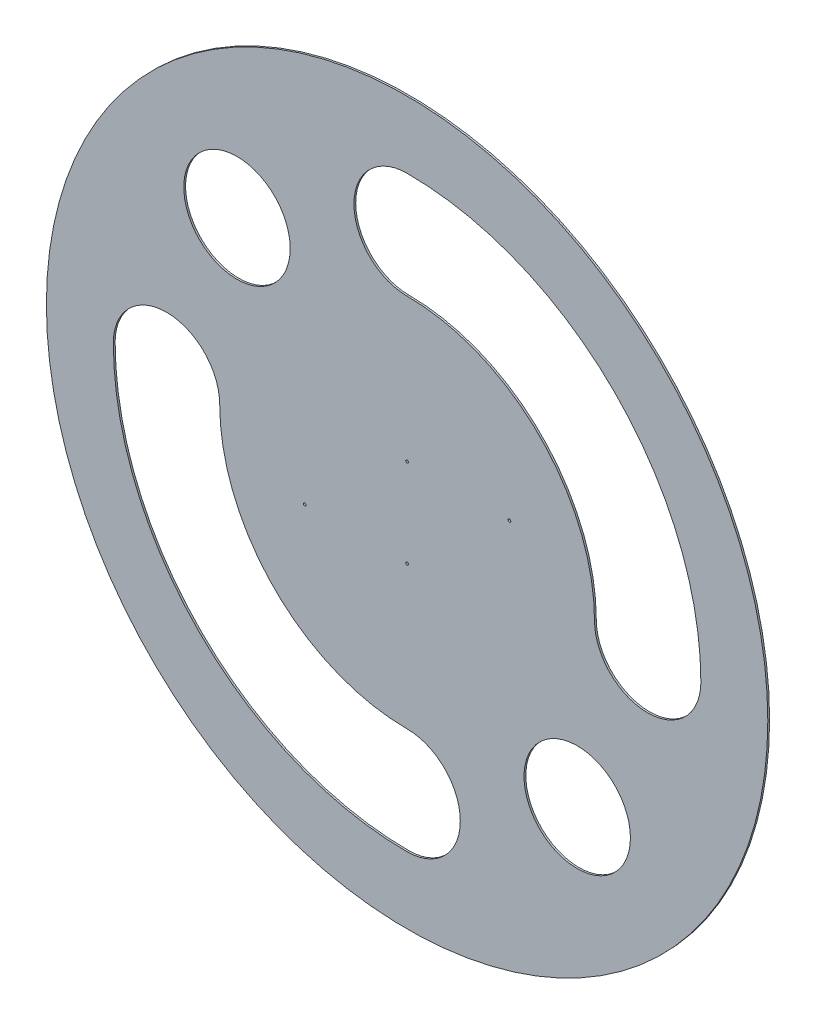
ISO-10303-21;
HEADER;
FILE_DESCRIPTION(('STEP AP214'),'2;1');
FILE_NAME('part.step','',(''),(''),'','','');
FILE_SCHEMA(('AUTOMOTIVE_DESIGN { 1 0 10303 214 1 1 1 1 }'));
ENDSEC;
DATA;
#1=APPLICATION_CONTEXT('core data for automotive mechanical design processes');
#2=APPLICATION_PROTOCOL_DEFINITION('international standard','automotive_design',2000,#1);
#3=PRODUCT_CONTEXT('',#1,'mechanical');
#4=PRODUCT('Part','Part','',(#3));
#5=PRODUCT_RELATED_PRODUCT_CATEGORY('part','',(#4));
#6=PRODUCT_DEFINITION_FORMATION('','',#4);
#7=PRODUCT_DEFINITION_CONTEXT('part definition',#1,'design');
#8=PRODUCT_DEFINITION('design','',#6,#7);
#9=PRODUCT_DEFINITION_SHAPE('','',#8);
#10=(LENGTH_UNIT() NAMED_UNIT(*) SI_UNIT(.MILLI.,.METRE.));
#11=(NAMED_UNIT(*) PLANE_ANGLE_UNIT() SI_UNIT($,.RADIAN.));
#12=(NAMED_UNIT(*) SI_UNIT($,.STERADIAN.) SOLID_ANGLE_UNIT());
#13=UNCERTAINTY_MEASURE_WITH_UNIT(LENGTH_MEASURE(1.E-05),#10,'distance_accuracy_value','');
#14=(GEOMETRIC_REPRESENTATION_CONTEXT(3) GLOBAL_UNCERTAINTY_ASSIGNED_CONTEXT((#13)) GLOBAL_UNIT_ASSIGNED_CONTEXT((#10,
#11,#12)) REPRESENTATION_CONTEXT('',''));
#15=CARTESIAN_POINT('',(0.,0.,0.));
#16=DIRECTION('',(0.,0.,1.));
#17=DIRECTION('',(1.,0.,0.));
#18=AXIS2_PLACEMENT_3D('',#15,#16,#17);
#19=CARTESIAN_POINT('',(0.,0.,2.));
#20=DIRECTION('',(0.,0.,-1.));
#21=DIRECTION('',(-1.,0.,0.));
#22=AXIS2_PLACEMENT_3D('',#19,#20,#21);
#23=CYLINDRICAL_SURFACE('',#22,325.76367295281);
#24=CARTESIAN_POINT('',(0.,0.,0.));
#25=DIRECTION('',(0.,0.,1.));
#26=DIRECTION('',(1.,0.,0.));
#27=AXIS2_PLACEMENT_3D('',#24,#25,#26);
#28=CIRCLE('',#27,325.76367295281);
#29=CARTESIAN_POINT('',(-3.4196483767755E-12,325.76367295281,0.));
#30=VERTEX_POINT('',#29);
#31=CARTESIAN_POINT('',(325.76367295281,0.,0.));
#32=VERTEX_POINT('',#31);
#33=EDGE_CURVE('E164',#30,#32,#28,.F.);
#34=ORIENTED_EDGE('',*,*,#33,.T.);
#35=DIRECTION('',(0.,0.,-1.));
#36=VECTOR('',#35,1.);
#37=CARTESIAN_POINT('',(325.76367295281,0.,2.));
#38=LINE('',#37,#36);
#39=CARTESIAN_POINT('',(325.76367295281,0.,2.));
#40=VERTEX_POINT('',#39);
#41=EDGE_CURVE('E11',#40,#32,#38,.T.);
#42=ORIENTED_EDGE('',*,*,#41,.F.);
#43=CARTESIAN_POINT('',(0.,0.,2.));
#44=DIRECTION('',(0.,0.,1.));
#45=DIRECTION('',(1.,0.,0.));
#46=AXIS2_PLACEMENT_3D('',#43,#44,#45);
#47=CIRCLE('',#46,325.76367295281);
#48=CARTESIAN_POINT('',(-3.4196483767755E-12,325.76367295281,2.));
#49=VERTEX_POINT('',#48);
#50=EDGE_CURVE('E114',#49,#40,#47,.F.);
#51=ORIENTED_EDGE('',*,*,#50,.F.);
#52=DIRECTION('',(0.,0.,-1.));
#53=VECTOR('',#52,1.);
#54=CARTESIAN_POINT('',(-3.4196483767755E-12,325.76367295281,2.));
#55=LINE('',#54,#53);
#56=EDGE_CURVE('E172',#49,#30,#55,.T.);
#57=ORIENTED_EDGE('',*,*,#56,.T.);
#58=EDGE_LOOP('',(#34,#42,#51,#57));
#59=FACE_BOUND('',#58,.T.);
#60=ADVANCED_FACE('F37',(#59),#23,.F.);
#61=CARTESIAN_POINT('',(266.784994262618,2.83106871279415E-12,2.));
#62=DIRECTION('',(0.,0.,-1.));
#63=DIRECTION('',(-1.,0.,0.));
#64=AXIS2_PLACEMENT_3D('',#61,#62,#63);
#65=CYLINDRICAL_SURFACE('',#64,58.978678690192);
#66=CARTESIAN_POINT('',(266.784994262618,2.83106871279415E-12,0.));
#67=DIRECTION('',(0.,0.,1.));
#68=DIRECTION('',(1.,0.,0.));
#69=AXIS2_PLACEMENT_3D('',#66,#67,#68);
#70=CIRCLE('',#69,58.978678690192);
#71=CARTESIAN_POINT('',(207.806315572426,0.,0.));
#72=VERTEX_POINT('',#71);
#73=EDGE_CURVE('E120',#32,#72,#70,.F.);
#74=ORIENTED_EDGE('',*,*,#73,.T.);
#75=DIRECTION('',(0.,0.,-1.));
#76=VECTOR('',#75,1.);
#77=CARTESIAN_POINT('',(207.806315572426,0.,2.));
#78=LINE('',#77,#76);
#79=CARTESIAN_POINT('',(207.806315572426,0.,2.));
#80=VERTEX_POINT('',#79);
#81=EDGE_CURVE('E47',#80,#72,#78,.T.);
#82=ORIENTED_EDGE('',*,*,#81,.F.);
#83=CARTESIAN_POINT('',(266.784994262618,2.83106871279415E-12,2.));
#84=DIRECTION('',(0.,0.,1.));
#85=DIRECTION('',(1.,0.,0.));
#86=AXIS2_PLACEMENT_3D('',#83,#84,#85);
#87=CIRCLE('',#86,58.978678690192);
#88=EDGE_CURVE('E108',#40,#80,#87,.F.);
#89=ORIENTED_EDGE('',*,*,#88,.F.);
#90=ORIENTED_EDGE('',*,*,#41,.T.);
#91=EDGE_LOOP('',(#74,#82,#89,#90));
#92=FACE_BOUND('',#91,.T.);
#93=ADVANCED_FACE('F119',(#92),#65,.F.);
#94=CARTESIAN_POINT('',(0.,0.,2.));
#95=DIRECTION('',(0.,0.,-1.));
#96=DIRECTION('',(-1.,0.,0.));
#97=AXIS2_PLACEMENT_3D('',#94,#95,#96);
#98=CYLINDRICAL_SURFACE('',#97,207.806315572426);
#99=CARTESIAN_POINT('',(0.,0.,0.));
#100=DIRECTION('',(0.,0.,1.));
#101=DIRECTION('',(1.,0.,0.));
#102=AXIS2_PLACEMENT_3D('',#99,#100,#101);
#103=CIRCLE('',#102,207.806315572426);
#104=CARTESIAN_POINT('',(-2.18141121534409E-12,207.806315572426,0.));
#105=VERTEX_POINT('',#104);
#106=EDGE_CURVE('E168',#105,#72,#103,.F.);
#107=ORIENTED_EDGE('',*,*,#106,.F.);
#108=DIRECTION('',(0.,0.,-1.));
#109=VECTOR('',#108,1.);
#110=CARTESIAN_POINT('',(-2.18141121534409E-12,207.806315572426,2.));
#111=LINE('',#110,#109);
#112=CARTESIAN_POINT('',(-2.18141121534409E-12,207.806315572426,2.));
#113=VERTEX_POINT('',#112);
#114=EDGE_CURVE('E84',#113,#105,#111,.T.);
#115=ORIENTED_EDGE('',*,*,#114,.F.);
#116=CARTESIAN_POINT('',(0.,0.,2.));
#117=DIRECTION('',(0.,0.,1.));
#118=DIRECTION('',(1.,0.,0.));
#119=AXIS2_PLACEMENT_3D('',#116,#117,#118);
#120=CIRCLE('',#119,207.806315572426);
#121=EDGE_CURVE('E112',#113,#80,#120,.F.);
#122=ORIENTED_EDGE('',*,*,#121,.T.);
#123=ORIENTED_EDGE('',*,*,#81,.T.);
#124=EDGE_LOOP('',(#107,#115,#122,#123));
#125=FACE_BOUND('',#124,.T.);
#126=ADVANCED_FACE('F125',(#125),#98,.T.);
#127=CARTESIAN_POINT('',(0.,-266.784994262618,2.));
#128=DIRECTION('',(0.,0.,-1.));
#129=DIRECTION('',(-1.,0.,0.));
#130=AXIS2_PLACEMENT_3D('',#127,#128,#129);
#131=CYLINDRICAL_SURFACE('',#130,58.978678690192);
#132=CARTESIAN_POINT('',(0.,-266.784994262618,0.));
#133=DIRECTION('',(0.,0.,1.));
#134=DIRECTION('',(1.,0.,0.));
#135=AXIS2_PLACEMENT_3D('',#132,#133,#134);
#136=CIRCLE('',#135,58.978678690192);
#137=CARTESIAN_POINT('',(0.,-325.76367295281,0.));
#138=VERTEX_POINT('',#137);
#139=CARTESIAN_POINT('',(0.,-207.806315572426,0.));
#140=VERTEX_POINT('',#139);
#141=EDGE_CURVE('E137',#138,#140,#136,.T.);
#142=ORIENTED_EDGE('',*,*,#141,.F.);
#143=DIRECTION('',(0.,0.,-1.));
#144=VECTOR('',#143,1.);
#145=CARTESIAN_POINT('',(0.,-325.76367295281,2.));
#146=LINE('',#145,#144);
#147=CARTESIAN_POINT('',(0.,-325.76367295281,2.));
#148=VERTEX_POINT('',#147);
#149=EDGE_CURVE('E41',#148,#138,#146,.T.);
#150=ORIENTED_EDGE('',*,*,#149,.F.);
#151=CARTESIAN_POINT('',(0.,-266.784994262618,2.));
#152=DIRECTION('',(0.,0.,1.));
#153=DIRECTION('',(1.,0.,0.));
#154=AXIS2_PLACEMENT_3D('',#151,#152,#153);
#155=CIRCLE('',#154,58.978678690192);
#156=CARTESIAN_POINT('',(0.,-207.806315572426,2.));
#157=VERTEX_POINT('',#156);
#158=EDGE_CURVE('E205',#148,#157,#155,.T.);
#159=ORIENTED_EDGE('',*,*,#158,.T.);
#160=DIRECTION('',(0.,0.,-1.));
#161=VECTOR('',#160,1.);
#162=CARTESIAN_POINT('',(0.,-207.806315572426,2.));
#163=LINE('',#162,#161);
#164=EDGE_CURVE('E127',#157,#140,#163,.T.);
#165=ORIENTED_EDGE('',*,*,#164,.T.);
#166=EDGE_LOOP('',(#142,#150,#159,#165));
#167=FACE_BOUND('',#166,.T.);
#168=ADVANCED_FACE('F187',(#167),#131,.F.);
#169=CARTESIAN_POINT('',(0.,0.,2.));
#170=DIRECTION('',(0.,0.,-1.));
#171=DIRECTION('',(-1.,0.,0.));
#172=AXIS2_PLACEMENT_3D('',#169,#170,#171);
#173=CYLINDRICAL_SURFACE('',#172,325.76367295281);
#174=CARTESIAN_POINT('',(0.,0.,0.));
#175=DIRECTION('',(0.,0.,1.));
#176=DIRECTION('',(1.,0.,0.));
#177=AXIS2_PLACEMENT_3D('',#174,#175,#176);
#178=CIRCLE('',#177,325.76367295281);
#179=CARTESIAN_POINT('',(-325.76367295281,0.,0.));
#180=VERTEX_POINT('',#179);
#181=EDGE_CURVE('E140',#180,#138,#178,.T.);
#182=ORIENTED_EDGE('',*,*,#181,.F.);
#183=DIRECTION('',(0.,0.,-1.));
#184=VECTOR('',#183,1.);
#185=CARTESIAN_POINT('',(-325.76367295281,0.,2.));
#186=LINE('',#185,#184);
#187=CARTESIAN_POINT('',(-325.76367295281,0.,2.));
#188=VERTEX_POINT('',#187);
#189=EDGE_CURVE('E177',#188,#180,#186,.T.);
#190=ORIENTED_EDGE('',*,*,#189,.F.);
#191=CARTESIAN_POINT('',(0.,0.,2.));
#192=DIRECTION('',(0.,0.,1.));
#193=DIRECTION('',(1.,0.,0.));
#194=AXIS2_PLACEMENT_3D('',#191,#192,#193);
#195=CIRCLE('',#194,325.76367295281);
#196=EDGE_CURVE('E186',#188,#148,#195,.T.);
#197=ORIENTED_EDGE('',*,*,#196,.T.);
#198=ORIENTED_EDGE('',*,*,#149,.T.);
#199=EDGE_LOOP('',(#182,#190,#197,#198));
#200=FACE_BOUND('',#199,.T.);
#201=ADVANCED_FACE('F184',(#200),#173,.F.);
#202=CARTESIAN_POINT('',(-266.784994262618,0.,2.));
#203=DIRECTION('',(0.,0.,-1.));
#204=DIRECTION('',(-1.,0.,0.));
#205=AXIS2_PLACEMENT_3D('',#202,#203,#204);
#206=CYLINDRICAL_SURFACE('',#205,58.978678690192);
#207=CARTESIAN_POINT('',(-266.784994262618,0.,0.));
#208=DIRECTION('',(0.,0.,1.));
#209=DIRECTION('',(1.,0.,0.));
#210=AXIS2_PLACEMENT_3D('',#207,#208,#209);
#211=CIRCLE('',#210,58.978678690192);
#212=CARTESIAN_POINT('',(-207.806315572426,0.,0.));
#213=VERTEX_POINT('',#212);
#214=EDGE_CURVE('E143',#213,#180,#211,.T.);
#215=ORIENTED_EDGE('',*,*,#214,.F.);
#216=DIRECTION('',(0.,0.,-1.));
#217=VECTOR('',#216,1.);
#218=CARTESIAN_POINT('',(-207.806315572426,0.,2.));
#219=LINE('',#218,#217);
#220=CARTESIAN_POINT('',(-207.806315572426,0.,2.));
#221=VERTEX_POINT('',#220);
#222=EDGE_CURVE('E176',#221,#213,#219,.T.);
#223=ORIENTED_EDGE('',*,*,#222,.F.);
#224=CARTESIAN_POINT('',(-266.784994262618,0.,2.));
#225=DIRECTION('',(0.,0.,1.));
#226=DIRECTION('',(1.,0.,0.));
#227=AXIS2_PLACEMENT_3D('',#224,#225,#226);
#228=CIRCLE('',#227,58.978678690192);
#229=EDGE_CURVE('E196',#221,#188,#228,.T.);
#230=ORIENTED_EDGE('',*,*,#229,.T.);
#231=ORIENTED_EDGE('',*,*,#189,.T.);
#232=EDGE_LOOP('',(#215,#223,#230,#231));
#233=FACE_BOUND('',#232,.T.);
#234=ADVANCED_FACE('F193',(#233),#206,.F.);
#235=CARTESIAN_POINT('',(0.,0.,2.));
#236=DIRECTION('',(0.,0.,-1.));
#237=DIRECTION('',(-1.,0.,0.));
#238=AXIS2_PLACEMENT_3D('',#235,#236,#237);
#239=CYLINDRICAL_SURFACE('',#238,400.);
#240=CARTESIAN_POINT('',(0.,0.,2.));
#241=DIRECTION('',(0.,0.,1.));
#242=DIRECTION('',(1.,0.,0.));
#243=AXIS2_PLACEMENT_3D('',#240,#241,#242);
#244=CIRCLE('',#243,400.);
#245=CARTESIAN_POINT('',(400.,0.,2.));
#246=VERTEX_POINT('',#245);
#247=EDGE_CURVE('E220',#246,#246,#244,.T.);
#248=ORIENTED_EDGE('',*,*,#247,.F.);
#249=EDGE_LOOP('',(#248));
#250=FACE_BOUND('',#249,.T.);
#251=CARTESIAN_POINT('',(0.,0.,0.));
#252=DIRECTION('',(0.,0.,1.));
#253=DIRECTION('',(1.,0.,0.));
#254=AXIS2_PLACEMENT_3D('',#251,#252,#253);
#255=CIRCLE('',#254,400.);
#256=CARTESIAN_POINT('',(400.,0.,0.));
#257=VERTEX_POINT('',#256);
#258=EDGE_CURVE('E161',#257,#257,#255,.T.);
#259=ORIENTED_EDGE('',*,*,#258,.T.);
#260=EDGE_LOOP('',(#259));
#261=FACE_BOUND('',#260,.T.);
#262=ADVANCED_FACE('F225',(#250,#261),#239,.T.);
#263=CARTESIAN_POINT('',(0.,-49.,2.));
#264=DIRECTION('',(0.,0.,-1.));
#265=DIRECTION('',(-1.,0.,0.));
#266=AXIS2_PLACEMENT_3D('',#263,#264,#265);
#267=CYLINDRICAL_SURFACE('',#266,1.5);
#268=CARTESIAN_POINT('',(0.,-49.,2.));
#269=DIRECTION('',(0.,0.,1.));
#270=DIRECTION('',(1.,0.,0.));
#271=AXIS2_PLACEMENT_3D('',#268,#269,#270);
#272=CIRCLE('',#271,1.5);
#273=CARTESIAN_POINT('',(1.5,-49.,2.));
#274=VERTEX_POINT('',#273);
#275=EDGE_CURVE('E217',#274,#274,#272,.T.);
#276=ORIENTED_EDGE('',*,*,#275,.T.);
#277=EDGE_LOOP('',(#276));
#278=FACE_BOUND('',#277,.T.);
#279=CARTESIAN_POINT('',(0.,-49.,0.));
#280=DIRECTION('',(0.,0.,1.));
#281=DIRECTION('',(1.,0.,0.));
#282=AXIS2_PLACEMENT_3D('',#279,#280,#281);
#283=CIRCLE('',#282,1.5);
#284=CARTESIAN_POINT('',(1.5,-49.,0.));
#285=VERTEX_POINT('',#284);
#286=EDGE_CURVE('E158',#285,#285,#283,.T.);
#287=ORIENTED_EDGE('',*,*,#286,.F.);
#288=EDGE_LOOP('',(#287));
#289=FACE_BOUND('',#288,.T.);
#290=ADVANCED_FACE('F228',(#278,#289),#267,.F.);
#291=CARTESIAN_POINT('',(0.,49.,2.));
#292=DIRECTION('',(0.,0.,-1.));
#293=DIRECTION('',(-1.,0.,0.));
#294=AXIS2_PLACEMENT_3D('',#291,#292,#293);
#295=CYLINDRICAL_SURFACE('',#294,1.5);
#296=CARTESIAN_POINT('',(0.,49.,2.));
#297=DIRECTION('',(0.,0.,1.));
#298=DIRECTION('',(1.,0.,0.));
#299=AXIS2_PLACEMENT_3D('',#296,#297,#298);
#300=CIRCLE('',#299,1.5);
#301=CARTESIAN_POINT('',(1.5,49.,2.));
#302=VERTEX_POINT('',#301);
#303=EDGE_CURVE('E214',#302,#302,#300,.T.);
#304=ORIENTED_EDGE('',*,*,#303,.T.);
#305=EDGE_LOOP('',(#304));
#306=FACE_BOUND('',#305,.T.);
#307=CARTESIAN_POINT('',(0.,49.,0.));
#308=DIRECTION('',(0.,0.,1.));
#309=DIRECTION('',(1.,0.,0.));
#310=AXIS2_PLACEMENT_3D('',#307,#308,#309);
#311=CIRCLE('',#310,1.5);
#312=CARTESIAN_POINT('',(1.5,49.,0.));
#313=VERTEX_POINT('',#312);
#314=EDGE_CURVE('E155',#313,#313,#311,.T.);
#315=ORIENTED_EDGE('',*,*,#314,.F.);
#316=EDGE_LOOP('',(#315));
#317=FACE_BOUND('',#316,.T.);
#318=ADVANCED_FACE('F259',(#306,#317),#295,.F.);
#319=CARTESIAN_POINT('',(-113.5,-49.,2.));
#320=DIRECTION('',(0.,0.,-1.));
#321=DIRECTION('',(-1.,0.,0.));
#322=AXIS2_PLACEMENT_3D('',#319,#320,#321);
#323=CYLINDRICAL_SURFACE('',#322,1.5);
#324=CARTESIAN_POINT('',(-113.5,-49.,2.));
#325=DIRECTION('',(0.,0.,1.));
#326=DIRECTION('',(1.,0.,0.));
#327=AXIS2_PLACEMENT_3D('',#324,#325,#326);
#328=CIRCLE('',#327,1.5);
#329=CARTESIAN_POINT('',(-112.,-49.,2.));
#330=VERTEX_POINT('',#329);
#331=EDGE_CURVE('E211',#330,#330,#328,.T.);
#332=ORIENTED_EDGE('',*,*,#331,.T.);
#333=EDGE_LOOP('',(#332));
#334=FACE_BOUND('',#333,.T.);
#335=CARTESIAN_POINT('',(-113.5,-49.,0.));
#336=DIRECTION('',(0.,0.,1.));
#337=DIRECTION('',(1.,0.,0.));
#338=AXIS2_PLACEMENT_3D('',#335,#336,#337);
#339=CIRCLE('',#338,1.5);
#340=CARTESIAN_POINT('',(-112.,-49.,0.));
#341=VERTEX_POINT('',#340);
#342=EDGE_CURVE('E152',#341,#341,#339,.T.);
#343=ORIENTED_EDGE('',*,*,#342,.F.);
#344=EDGE_LOOP('',(#343));
#345=FACE_BOUND('',#344,.T.);
#346=ADVANCED_FACE('F263',(#334,#345),#323,.F.);
#347=CARTESIAN_POINT('',(113.5,49.,2.));
#348=DIRECTION('',(0.,0.,-1.));
#349=DIRECTION('',(-1.,0.,0.));
#350=AXIS2_PLACEMENT_3D('',#347,#348,#349);
#351=CYLINDRICAL_SURFACE('',#350,1.5);
#352=CARTESIAN_POINT('',(113.5,49.,2.));
#353=DIRECTION('',(0.,0.,1.));
#354=DIRECTION('',(1.,0.,0.));
#355=AXIS2_PLACEMENT_3D('',#352,#353,#354);
#356=CIRCLE('',#355,1.5);
#357=CARTESIAN_POINT('',(115.,49.,2.));
#358=VERTEX_POINT('',#357);
#359=EDGE_CURVE('E201',#358,#358,#356,.T.);
#360=ORIENTED_EDGE('',*,*,#359,.T.);
#361=EDGE_LOOP('',(#360));
#362=FACE_BOUND('',#361,.T.);
#363=CARTESIAN_POINT('',(113.5,49.,0.));
#364=DIRECTION('',(0.,0.,1.));
#365=DIRECTION('',(1.,0.,0.));
#366=AXIS2_PLACEMENT_3D('',#363,#364,#365);
#367=CIRCLE('',#366,1.5);
#368=CARTESIAN_POINT('',(115.,49.,0.));
#369=VERTEX_POINT('',#368);
#370=EDGE_CURVE('E149',#369,#369,#367,.T.);
#371=ORIENTED_EDGE('',*,*,#370,.F.);
#372=EDGE_LOOP('',(#371));
#373=FACE_BOUND('',#372,.T.);
#374=ADVANCED_FACE('F267',(#362,#373),#351,.F.);
#375=CARTESIAN_POINT('',(0.,0.,2.));
#376=DIRECTION('',(0.,0.,-1.));
#377=DIRECTION('',(-1.,0.,0.));
#378=AXIS2_PLACEMENT_3D('',#375,#376,#377);
#379=CYLINDRICAL_SURFACE('',#378,207.806315572426);
#380=CARTESIAN_POINT('',(0.,0.,0.));
#381=DIRECTION('',(0.,0.,1.));
#382=DIRECTION('',(1.,0.,0.));
#383=AXIS2_PLACEMENT_3D('',#380,#381,#382);
#384=CIRCLE('',#383,207.806315572426);
#385=EDGE_CURVE('E146',#213,#140,#384,.T.);
#386=ORIENTED_EDGE('',*,*,#385,.T.);
#387=ORIENTED_EDGE('',*,*,#164,.F.);
#388=CARTESIAN_POINT('',(0.,0.,2.));
#389=DIRECTION('',(0.,0.,1.));
#390=DIRECTION('',(1.,0.,0.));
#391=AXIS2_PLACEMENT_3D('',#388,#389,#390);
#392=CIRCLE('',#391,207.806315572426);
#393=EDGE_CURVE('E198',#221,#157,#392,.T.);
#394=ORIENTED_EDGE('',*,*,#393,.F.);
#395=ORIENTED_EDGE('',*,*,#222,.T.);
#396=EDGE_LOOP('',(#386,#387,#394,#395));
#397=FACE_BOUND('',#396,.T.);
#398=ADVANCED_FACE('F199',(#397),#379,.T.);
#399=CARTESIAN_POINT('',(-188.645478561912,188.64547856191,2.));
#400=DIRECTION('',(0.,0.,-1.));
#401=DIRECTION('',(-1.,0.,0.));
#402=AXIS2_PLACEMENT_3D('',#399,#400,#401);
#403=CYLINDRICAL_SURFACE('',#402,59.);
#404=CARTESIAN_POINT('',(-188.645478561912,188.64547856191,2.));
#405=DIRECTION('',(0.,0.,1.));
#406=DIRECTION('',(1.,0.,0.));
#407=AXIS2_PLACEMENT_3D('',#404,#405,#406);
#408=CIRCLE('',#407,59.);
#409=CARTESIAN_POINT('',(-129.645478561912,188.64547856191,2.));
#410=VERTEX_POINT('',#409);
#411=EDGE_CURVE('E286',#410,#410,#408,.T.);
#412=ORIENTED_EDGE('',*,*,#411,.T.);
#413=EDGE_LOOP('',(#412));
#414=FACE_BOUND('',#413,.T.);
#415=CARTESIAN_POINT('',(-188.645478561912,188.64547856191,0.));
#416=DIRECTION('',(0.,0.,1.));
#417=DIRECTION('',(1.,0.,0.));
#418=AXIS2_PLACEMENT_3D('',#415,#416,#417);
#419=CIRCLE('',#418,59.);
#420=CARTESIAN_POINT('',(-129.645478561912,188.64547856191,0.));
#421=VERTEX_POINT('',#420);
#422=EDGE_CURVE('E134',#421,#421,#419,.T.);
#423=ORIENTED_EDGE('',*,*,#422,.F.);
#424=EDGE_LOOP('',(#423));
#425=FACE_BOUND('',#424,.T.);
#426=ADVANCED_FACE('F247',(#414,#425),#403,.F.);
#427=CARTESIAN_POINT('',(188.645478561913,-188.645478561911,2.));
#428=DIRECTION('',(0.,0.,-1.));
#429=DIRECTION('',(-1.,0.,0.));
#430=AXIS2_PLACEMENT_3D('',#427,#428,#429);
#431=CYLINDRICAL_SURFACE('',#430,59.);
#432=CARTESIAN_POINT('',(188.645478561913,-188.645478561911,2.));
#433=DIRECTION('',(0.,0.,1.));
#434=DIRECTION('',(1.,0.,0.));
#435=AXIS2_PLACEMENT_3D('',#432,#433,#434);
#436=CIRCLE('',#435,59.);
#437=CARTESIAN_POINT('',(247.645478561913,-188.645478561911,2.));
#438=VERTEX_POINT('',#437);
#439=EDGE_CURVE('E171',#438,#438,#436,.T.);
#440=ORIENTED_EDGE('',*,*,#439,.T.);
#441=EDGE_LOOP('',(#440));
#442=FACE_BOUND('',#441,.T.);
#443=CARTESIAN_POINT('',(188.645478561913,-188.645478561911,0.));
#444=DIRECTION('',(0.,0.,1.));
#445=DIRECTION('',(1.,0.,0.));
#446=AXIS2_PLACEMENT_3D('',#443,#444,#445);
#447=CIRCLE('',#446,59.);
#448=CARTESIAN_POINT('',(247.645478561913,-188.645478561911,0.));
#449=VERTEX_POINT('',#448);
#450=EDGE_CURVE('E131',#449,#449,#447,.T.);
#451=ORIENTED_EDGE('',*,*,#450,.F.);
#452=EDGE_LOOP('',(#451));
#453=FACE_BOUND('',#452,.T.);
#454=ADVANCED_FACE('F39',(#442,#453),#431,.F.);
#455=CARTESIAN_POINT('',(-2.77555756156289E-12,266.784994262618,2.));
#456=DIRECTION('',(0.,0.,-1.));
#457=DIRECTION('',(-1.,0.,0.));
#458=AXIS2_PLACEMENT_3D('',#455,#456,#457);
#459=CYLINDRICAL_SURFACE('',#458,58.978678690192);
#460=CARTESIAN_POINT('',(-2.77555756156289E-12,266.784994262618,0.));
#461=DIRECTION('',(0.,0.,1.));
#462=DIRECTION('',(1.,0.,0.));
#463=AXIS2_PLACEMENT_3D('',#460,#461,#462);
#464=CIRCLE('',#463,58.978678690192);
#465=EDGE_CURVE('E87',#105,#30,#464,.F.);
#466=ORIENTED_EDGE('',*,*,#465,.T.);
#467=ORIENTED_EDGE('',*,*,#56,.F.);
#468=CARTESIAN_POINT('',(-2.77555756156289E-12,266.784994262618,2.));
#469=DIRECTION('',(0.,0.,1.));
#470=DIRECTION('',(1.,0.,0.));
#471=AXIS2_PLACEMENT_3D('',#468,#469,#470);
#472=CIRCLE('',#471,58.978678690192);
#473=EDGE_CURVE('E56',#113,#49,#472,.F.);
#474=ORIENTED_EDGE('',*,*,#473,.F.);
#475=ORIENTED_EDGE('',*,*,#114,.T.);
#476=EDGE_LOOP('',(#466,#467,#474,#475));
#477=FACE_BOUND('',#476,.T.);
#478=ADVANCED_FACE('F238',(#477),#459,.F.);
#479=CARTESIAN_POINT('',(0.,0.,2.));
#480=DIRECTION('',(0.,0.,1.));
#481=DIRECTION('',(1.,0.,0.));
#482=AXIS2_PLACEMENT_3D('',#479,#480,#481);
#483=PLANE('',#482);
#484=ORIENTED_EDGE('',*,*,#439,.F.);
#485=EDGE_LOOP('',(#484));
#486=FACE_BOUND('',#485,.T.);
#487=ORIENTED_EDGE('',*,*,#411,.F.);
#488=EDGE_LOOP('',(#487));
#489=FACE_BOUND('',#488,.T.);
#490=ORIENTED_EDGE('',*,*,#158,.F.);
#491=ORIENTED_EDGE('',*,*,#196,.F.);
#492=ORIENTED_EDGE('',*,*,#229,.F.);
#493=ORIENTED_EDGE('',*,*,#393,.T.);
#494=EDGE_LOOP('',(#490,#491,#492,#493));
#495=FACE_BOUND('',#494,.T.);
#496=ORIENTED_EDGE('',*,*,#359,.F.);
#497=EDGE_LOOP('',(#496));
#498=FACE_BOUND('',#497,.T.);
#499=ORIENTED_EDGE('',*,*,#331,.F.);
#500=EDGE_LOOP('',(#499));
#501=FACE_BOUND('',#500,.T.);
#502=ORIENTED_EDGE('',*,*,#303,.F.);
#503=EDGE_LOOP('',(#502));
#504=FACE_BOUND('',#503,.T.);
#505=ORIENTED_EDGE('',*,*,#275,.F.);
#506=EDGE_LOOP('',(#505));
#507=FACE_BOUND('',#506,.T.);
#508=ORIENTED_EDGE('',*,*,#247,.T.);
#509=EDGE_LOOP('',(#508));
#510=FACE_BOUND('',#509,.T.);
#511=ORIENTED_EDGE('',*,*,#50,.T.);
#512=ORIENTED_EDGE('',*,*,#88,.T.);
#513=ORIENTED_EDGE('',*,*,#121,.F.);
#514=ORIENTED_EDGE('',*,*,#473,.T.);
#515=EDGE_LOOP('',(#511,#512,#513,#514));
#516=FACE_BOUND('',#515,.T.);
#517=ADVANCED_FACE('F110',(#486,#489,#495,#498,#501,#504,#507,#510,#516),#483,.T.);
#518=CARTESIAN_POINT('',(0.,0.,0.));
#519=DIRECTION('',(0.,0.,1.));
#520=DIRECTION('',(1.,0.,0.));
#521=AXIS2_PLACEMENT_3D('',#518,#519,#520);
#522=PLANE('',#521);
#523=ORIENTED_EDGE('',*,*,#450,.T.);
#524=EDGE_LOOP('',(#523));
#525=FACE_BOUND('',#524,.T.);
#526=ORIENTED_EDGE('',*,*,#422,.T.);
#527=EDGE_LOOP('',(#526));
#528=FACE_BOUND('',#527,.T.);
#529=ORIENTED_EDGE('',*,*,#141,.T.);
#530=ORIENTED_EDGE('',*,*,#385,.F.);
#531=ORIENTED_EDGE('',*,*,#214,.T.);
#532=ORIENTED_EDGE('',*,*,#181,.T.);
#533=EDGE_LOOP('',(#529,#530,#531,#532));
#534=FACE_BOUND('',#533,.T.);
#535=ORIENTED_EDGE('',*,*,#370,.T.);
#536=EDGE_LOOP('',(#535));
#537=FACE_BOUND('',#536,.T.);
#538=ORIENTED_EDGE('',*,*,#342,.T.);
#539=EDGE_LOOP('',(#538));
#540=FACE_BOUND('',#539,.T.);
#541=ORIENTED_EDGE('',*,*,#314,.T.);
#542=EDGE_LOOP('',(#541));
#543=FACE_BOUND('',#542,.T.);
#544=ORIENTED_EDGE('',*,*,#286,.T.);
#545=EDGE_LOOP('',(#544));
#546=FACE_BOUND('',#545,.T.);
#547=ORIENTED_EDGE('',*,*,#258,.F.);
#548=EDGE_LOOP('',(#547));
#549=FACE_BOUND('',#548,.T.);
#550=ORIENTED_EDGE('',*,*,#33,.F.);
#551=ORIENTED_EDGE('',*,*,#465,.F.);
#552=ORIENTED_EDGE('',*,*,#106,.T.);
#553=ORIENTED_EDGE('',*,*,#73,.F.);
#554=EDGE_LOOP('',(#550,#551,#552,#553));
#555=FACE_BOUND('',#554,.T.);
#556=ADVANCED_FACE('F191',(#525,#528,#534,#537,#540,#543,#546,#549,#555),#522,.F.);
#557=CLOSED_SHELL('',(#60,#93,#126,#168,#201,#234,#262,#290,#318,#346,#374,#398,#426,#454,#478,
#517,#556));
#558=MANIFOLD_SOLID_BREP('B2',#557);
#559=ADVANCED_BREP_SHAPE_REPRESENTATION('',(#18,#558),#14);
#560=SHAPE_DEFINITION_REPRESENTATION(#9,#559);
ENDSEC;
END-ISO-10303-21;
